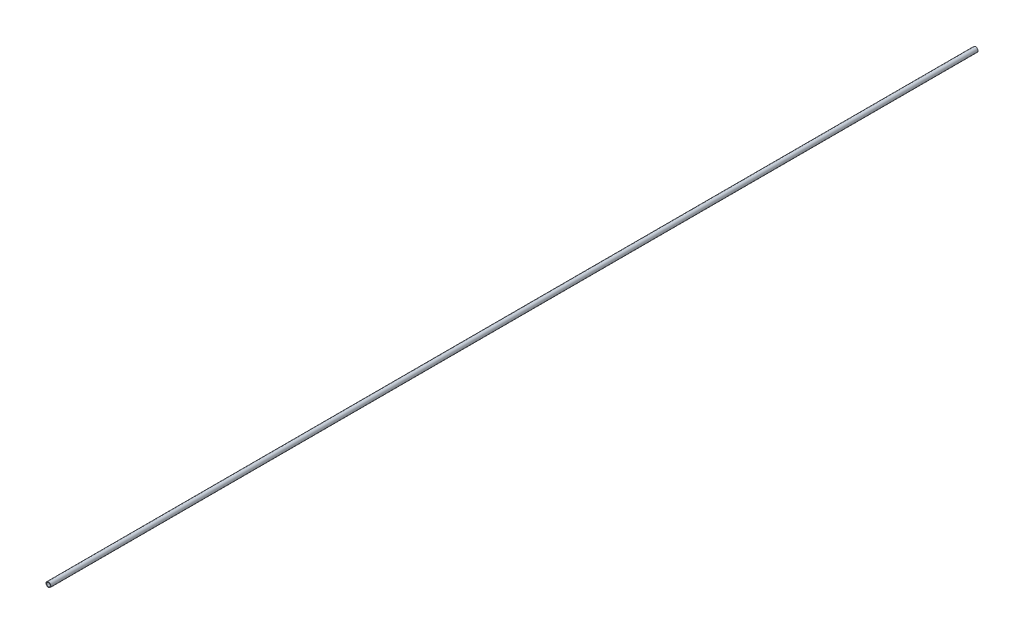
ISO-10303-21;
HEADER;
FILE_DESCRIPTION(('STEP AP214'),'2;1');
FILE_NAME('part.step','',(''),(''),'','','');
FILE_SCHEMA(('AUTOMOTIVE_DESIGN { 1 0 10303 214 1 1 1 1 }'));
ENDSEC;
DATA;
#1=APPLICATION_CONTEXT('core data for automotive mechanical design processes');
#2=APPLICATION_PROTOCOL_DEFINITION('international standard','automotive_design',2000,#1);
#3=PRODUCT_CONTEXT('',#1,'mechanical');
#4=PRODUCT('Part','Part','',(#3));
#5=PRODUCT_RELATED_PRODUCT_CATEGORY('part','',(#4));
#6=PRODUCT_DEFINITION_FORMATION('','',#4);
#7=PRODUCT_DEFINITION_CONTEXT('part definition',#1,'design');
#8=PRODUCT_DEFINITION('design','',#6,#7);
#9=PRODUCT_DEFINITION_SHAPE('','',#8);
#10=(LENGTH_UNIT() NAMED_UNIT(*) SI_UNIT(.MILLI.,.METRE.));
#11=(NAMED_UNIT(*) PLANE_ANGLE_UNIT() SI_UNIT($,.RADIAN.));
#12=(NAMED_UNIT(*) SI_UNIT($,.STERADIAN.) SOLID_ANGLE_UNIT());
#13=UNCERTAINTY_MEASURE_WITH_UNIT(LENGTH_MEASURE(1.E-05),#10,'distance_accuracy_value','');
#14=(GEOMETRIC_REPRESENTATION_CONTEXT(3) GLOBAL_UNCERTAINTY_ASSIGNED_CONTEXT((#13)) GLOBAL_UNIT_ASSIGNED_CONTEXT((#10,
#11,#12)) REPRESENTATION_CONTEXT('',''));
#15=CARTESIAN_POINT('',(0.,0.,0.));
#16=DIRECTION('',(0.,0.,1.));
#17=DIRECTION('',(1.,0.,0.));
#18=AXIS2_PLACEMENT_3D('',#15,#16,#17);
#19=CARTESIAN_POINT('',(0.,0.,457.2));
#20=DIRECTION('',(0.,0.,1.));
#21=DIRECTION('',(1.,0.,0.));
#22=AXIS2_PLACEMENT_3D('',#19,#20,#21);
#23=PLANE('',#22);
#24=CARTESIAN_POINT('',(0.,0.,457.2));
#25=DIRECTION('',(0.,0.,1.));
#26=DIRECTION('',(1.,0.,0.));
#27=AXIS2_PLACEMENT_3D('',#24,#25,#26);
#28=CIRCLE('',#27,2.38125);
#29=CARTESIAN_POINT('',(2.38125,0.,457.2));
#30=VERTEX_POINT('',#29);
#31=EDGE_CURVE('E10',#30,#30,#28,.T.);
#32=ORIENTED_EDGE('',*,*,#31,.T.);
#33=EDGE_LOOP('',(#32));
#34=FACE_BOUND('',#33,.T.);
#35=CARTESIAN_POINT('',(0.,0.,457.2));
#36=DIRECTION('',(0.,0.,1.));
#37=DIRECTION('',(1.,0.,0.));
#38=AXIS2_PLACEMENT_3D('',#35,#36,#37);
#39=CIRCLE('',#38,1.8288);
#40=CARTESIAN_POINT('',(1.8288,0.,457.2));
#41=VERTEX_POINT('',#40);
#42=EDGE_CURVE('E41',#41,#41,#39,.T.);
#43=ORIENTED_EDGE('',*,*,#42,.F.);
#44=EDGE_LOOP('',(#43));
#45=FACE_BOUND('',#44,.T.);
#46=ADVANCED_FACE('F30',(#34,#45),#23,.T.);
#47=CARTESIAN_POINT('',(0.,0.,-457.2));
#48=DIRECTION('',(0.,0.,1.));
#49=DIRECTION('',(1.,0.,0.));
#50=AXIS2_PLACEMENT_3D('',#47,#48,#49);
#51=PLANE('',#50);
#52=CARTESIAN_POINT('',(0.,0.,-457.2));
#53=DIRECTION('',(0.,0.,1.));
#54=DIRECTION('',(1.,0.,0.));
#55=AXIS2_PLACEMENT_3D('',#52,#53,#54);
#56=CIRCLE('',#55,2.38125);
#57=CARTESIAN_POINT('',(2.38125,0.,-457.2));
#58=VERTEX_POINT('',#57);
#59=EDGE_CURVE('E34',#58,#58,#56,.T.);
#60=ORIENTED_EDGE('',*,*,#59,.F.);
#61=EDGE_LOOP('',(#60));
#62=FACE_BOUND('',#61,.T.);
#63=CARTESIAN_POINT('',(0.,0.,-457.2));
#64=DIRECTION('',(0.,0.,1.));
#65=DIRECTION('',(1.,0.,0.));
#66=AXIS2_PLACEMENT_3D('',#63,#64,#65);
#67=CIRCLE('',#66,1.8288);
#68=CARTESIAN_POINT('',(1.8288,0.,-457.2));
#69=VERTEX_POINT('',#68);
#70=EDGE_CURVE('E43',#69,#69,#67,.T.);
#71=ORIENTED_EDGE('',*,*,#70,.T.);
#72=EDGE_LOOP('',(#71));
#73=FACE_BOUND('',#72,.T.);
#74=ADVANCED_FACE('F53',(#62,#73),#51,.F.);
#75=CARTESIAN_POINT('',(0.,0.,457.2));
#76=DIRECTION('',(0.,0.,-1.));
#77=DIRECTION('',(-1.,0.,0.));
#78=AXIS2_PLACEMENT_3D('',#75,#76,#77);
#79=CYLINDRICAL_SURFACE('',#78,2.38125);
#80=ORIENTED_EDGE('',*,*,#31,.F.);
#81=EDGE_LOOP('',(#80));
#82=FACE_BOUND('',#81,.T.);
#83=ORIENTED_EDGE('',*,*,#59,.T.);
#84=EDGE_LOOP('',(#83));
#85=FACE_BOUND('',#84,.T.);
#86=ADVANCED_FACE('F32',(#82,#85),#79,.T.);
#87=CARTESIAN_POINT('',(0.,0.,457.2));
#88=DIRECTION('',(0.,0.,-1.));
#89=DIRECTION('',(-1.,0.,0.));
#90=AXIS2_PLACEMENT_3D('',#87,#88,#89);
#91=CYLINDRICAL_SURFACE('',#90,1.8288);
#92=ORIENTED_EDGE('',*,*,#42,.T.);
#93=EDGE_LOOP('',(#92));
#94=FACE_BOUND('',#93,.T.);
#95=ORIENTED_EDGE('',*,*,#70,.F.);
#96=EDGE_LOOP('',(#95));
#97=FACE_BOUND('',#96,.T.);
#98=ADVANCED_FACE('F49',(#94,#97),#91,.F.);
#99=CLOSED_SHELL('',(#46,#74,#86,#98));
#100=MANIFOLD_SOLID_BREP('B2',#99);
#101=ADVANCED_BREP_SHAPE_REPRESENTATION('',(#18,#100),#14);
#102=SHAPE_DEFINITION_REPRESENTATION(#9,#101);
ENDSEC;
END-ISO-10303-21;
